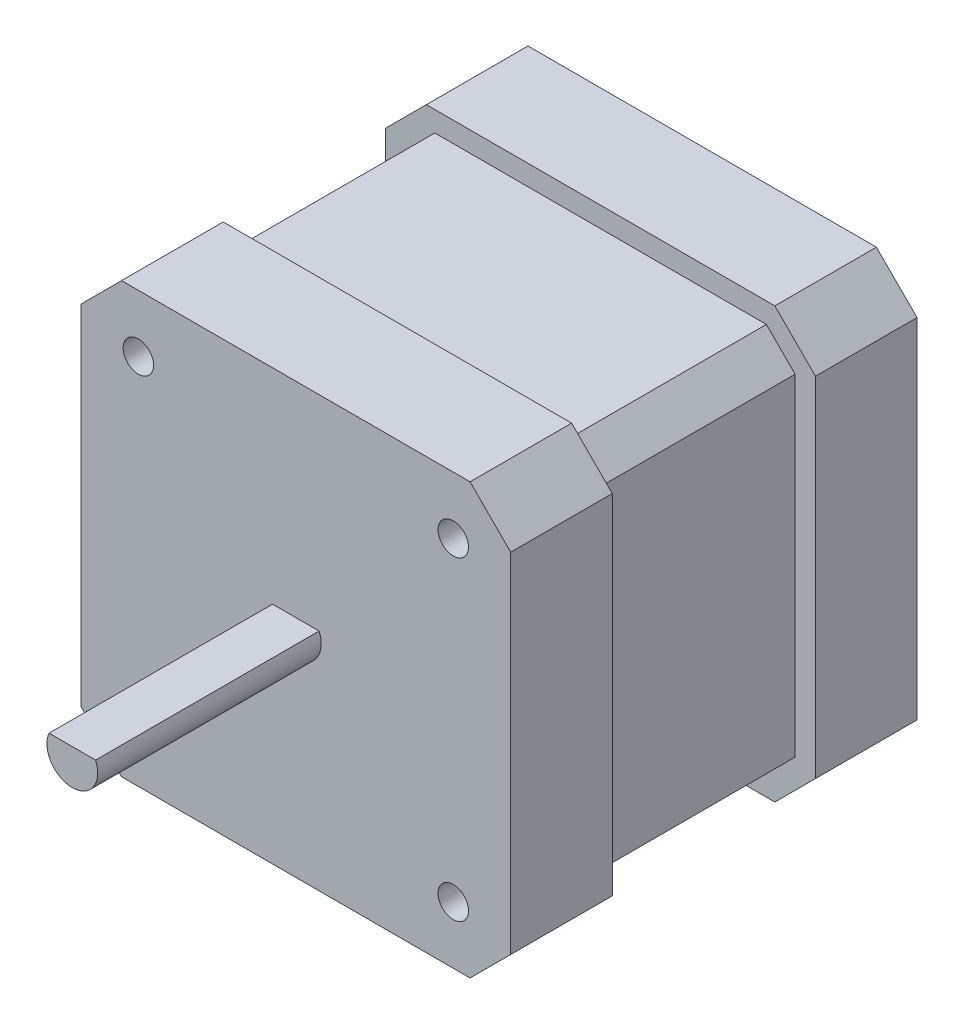
ISO-10303-21;
HEADER;
FILE_DESCRIPTION(('STEP AP214'),'2;1');
FILE_NAME('part.step','',(''),(''),'','','');
FILE_SCHEMA(('AUTOMOTIVE_DESIGN { 1 0 10303 214 1 1 1 1 }'));
ENDSEC;
DATA;
#1=APPLICATION_CONTEXT('core data for automotive mechanical design processes');
#2=APPLICATION_PROTOCOL_DEFINITION('international standard','automotive_design',2000,#1);
#3=PRODUCT_CONTEXT('',#1,'mechanical');
#4=PRODUCT('Part','Part','',(#3));
#5=PRODUCT_RELATED_PRODUCT_CATEGORY('part','',(#4));
#6=PRODUCT_DEFINITION_FORMATION('','',#4);
#7=PRODUCT_DEFINITION_CONTEXT('part definition',#1,'design');
#8=PRODUCT_DEFINITION('design','',#6,#7);
#9=PRODUCT_DEFINITION_SHAPE('','',#8);
#10=(LENGTH_UNIT() NAMED_UNIT(*) SI_UNIT(.MILLI.,.METRE.));
#11=(NAMED_UNIT(*) PLANE_ANGLE_UNIT() SI_UNIT($,.RADIAN.));
#12=(NAMED_UNIT(*) SI_UNIT($,.STERADIAN.) SOLID_ANGLE_UNIT());
#13=UNCERTAINTY_MEASURE_WITH_UNIT(LENGTH_MEASURE(1.E-05),#10,'distance_accuracy_value','');
#14=(GEOMETRIC_REPRESENTATION_CONTEXT(3) GLOBAL_UNCERTAINTY_ASSIGNED_CONTEXT((#13)) GLOBAL_UNIT_ASSIGNED_CONTEXT((#10,
#11,#12)) REPRESENTATION_CONTEXT('',''));
#15=CARTESIAN_POINT('',(0.,0.,0.));
#16=DIRECTION('',(0.,0.,1.));
#17=DIRECTION('',(1.,0.,0.));
#18=AXIS2_PLACEMENT_3D('',#15,#16,#17);
#19=CARTESIAN_POINT('',(0.,0.,10.));
#20=DIRECTION('',(0.,0.,-1.));
#21=DIRECTION('',(-1.,0.,0.));
#22=AXIS2_PLACEMENT_3D('',#19,#20,#21);
#23=PLANE('',#22);
#24=CARTESIAN_POINT('',(-15.5,-15.5,10.));
#25=DIRECTION('',(0.,0.,1.));
#26=DIRECTION('',(1.,0.,0.));
#27=AXIS2_PLACEMENT_3D('',#24,#25,#26);
#28=CIRCLE('',#27,1.5);
#29=CARTESIAN_POINT('',(-14.,-15.5,10.));
#30=VERTEX_POINT('',#29);
#31=EDGE_CURVE('E812',#30,#30,#28,.T.);
#32=ORIENTED_EDGE('',*,*,#31,.F.);
#33=EDGE_LOOP('',(#32));
#34=FACE_BOUND('',#33,.T.);
#35=CARTESIAN_POINT('',(15.5,-15.5,10.));
#36=DIRECTION('',(0.,0.,1.));
#37=DIRECTION('',(1.,0.,0.));
#38=AXIS2_PLACEMENT_3D('',#35,#36,#37);
#39=CIRCLE('',#38,1.5);
#40=CARTESIAN_POINT('',(17.,-15.5,10.));
#41=VERTEX_POINT('',#40);
#42=EDGE_CURVE('E830',#41,#41,#39,.T.);
#43=ORIENTED_EDGE('',*,*,#42,.F.);
#44=EDGE_LOOP('',(#43));
#45=FACE_BOUND('',#44,.T.);
#46=CARTESIAN_POINT('',(15.5,15.5,10.));
#47=DIRECTION('',(0.,0.,1.));
#48=DIRECTION('',(1.,0.,0.));
#49=AXIS2_PLACEMENT_3D('',#46,#47,#48);
#50=CIRCLE('',#49,1.5);
#51=CARTESIAN_POINT('',(17.,15.5,10.));
#52=VERTEX_POINT('',#51);
#53=EDGE_CURVE('E821',#52,#52,#50,.T.);
#54=ORIENTED_EDGE('',*,*,#53,.F.);
#55=EDGE_LOOP('',(#54));
#56=FACE_BOUND('',#55,.T.);
#57=CARTESIAN_POINT('',(-15.5,15.5,10.));
#58=DIRECTION('',(0.,0.,1.));
#59=DIRECTION('',(1.,0.,0.));
#60=AXIS2_PLACEMENT_3D('',#57,#58,#59);
#61=CIRCLE('',#60,1.5);
#62=CARTESIAN_POINT('',(-14.,15.5,10.));
#63=VERTEX_POINT('',#62);
#64=EDGE_CURVE('E239',#63,#63,#61,.T.);
#65=ORIENTED_EDGE('',*,*,#64,.F.);
#66=EDGE_LOOP('',(#65));
#67=FACE_BOUND('',#66,.T.);
#68=DIRECTION('',(0.707106781186547,0.707106781186548,0.));
#69=VECTOR('',#68,1.);
#70=CARTESIAN_POINT('',(-21.15,17.15,10.));
#71=LINE('',#70,#69);
#72=CARTESIAN_POINT('',(-21.15,17.15,10.));
#73=VERTEX_POINT('',#72);
#74=CARTESIAN_POINT('',(-17.15,21.15,10.));
#75=VERTEX_POINT('',#74);
#76=EDGE_CURVE('E372',#73,#75,#71,.T.);
#77=ORIENTED_EDGE('',*,*,#76,.F.);
#78=DIRECTION('',(0.,1.,0.));
#79=VECTOR('',#78,1.);
#80=CARTESIAN_POINT('',(-21.15,-17.15,10.));
#81=LINE('',#80,#79);
#82=CARTESIAN_POINT('',(-21.15,-17.15,10.));
#83=VERTEX_POINT('',#82);
#84=EDGE_CURVE('E390',#83,#73,#81,.T.);
#85=ORIENTED_EDGE('',*,*,#84,.F.);
#86=DIRECTION('',(0.707106781186548,-0.707106781186547,0.));
#87=VECTOR('',#86,1.);
#88=CARTESIAN_POINT('',(-21.15,-17.15,10.));
#89=LINE('',#88,#87);
#90=CARTESIAN_POINT('',(-17.15,-21.15,10.));
#91=VERTEX_POINT('',#90);
#92=EDGE_CURVE('E388',#83,#91,#89,.T.);
#93=ORIENTED_EDGE('',*,*,#92,.T.);
#94=DIRECTION('',(1.,0.,0.));
#95=VECTOR('',#94,1.);
#96=CARTESIAN_POINT('',(-17.15,-21.15,10.));
#97=LINE('',#96,#95);
#98=CARTESIAN_POINT('',(17.15,-21.15,10.));
#99=VERTEX_POINT('',#98);
#100=EDGE_CURVE('E386',#91,#99,#97,.T.);
#101=ORIENTED_EDGE('',*,*,#100,.T.);
#102=DIRECTION('',(0.707106781186548,0.707106781186547,0.));
#103=VECTOR('',#102,1.);
#104=CARTESIAN_POINT('',(17.15,-21.15,10.));
#105=LINE('',#104,#103);
#106=CARTESIAN_POINT('',(21.15,-17.15,10.));
#107=VERTEX_POINT('',#106);
#108=EDGE_CURVE('E384',#99,#107,#105,.T.);
#109=ORIENTED_EDGE('',*,*,#108,.T.);
#110=DIRECTION('',(0.,1.,0.));
#111=VECTOR('',#110,1.);
#112=CARTESIAN_POINT('',(21.15,-17.15,10.));
#113=LINE('',#112,#111);
#114=CARTESIAN_POINT('',(21.15,17.15,10.));
#115=VERTEX_POINT('',#114);
#116=EDGE_CURVE('E382',#107,#115,#113,.T.);
#117=ORIENTED_EDGE('',*,*,#116,.T.);
#118=DIRECTION('',(0.707106781186547,-0.707106781186548,0.));
#119=VECTOR('',#118,1.);
#120=CARTESIAN_POINT('',(17.15,21.15,10.));
#121=LINE('',#120,#119);
#122=CARTESIAN_POINT('',(17.15,21.15,10.));
#123=VERTEX_POINT('',#122);
#124=EDGE_CURVE('E379',#123,#115,#121,.T.);
#125=ORIENTED_EDGE('',*,*,#124,.F.);
#126=DIRECTION('',(1.,0.,0.));
#127=VECTOR('',#126,1.);
#128=CARTESIAN_POINT('',(-17.15,21.15,10.));
#129=LINE('',#128,#127);
#130=EDGE_CURVE('E375',#75,#123,#129,.T.);
#131=ORIENTED_EDGE('',*,*,#130,.F.);
#132=EDGE_LOOP('',(#77,#85,#93,#101,#109,#117,#125,#131));
#133=FACE_BOUND('',#132,.T.);
#134=CARTESIAN_POINT('',(0.,0.,10.));
#135=DIRECTION('',(0.,0.,1.));
#136=DIRECTION('',(1.,0.,0.));
#137=AXIS2_PLACEMENT_3D('',#134,#135,#136);
#138=CIRCLE('',#137,2.5);
#139=CARTESIAN_POINT('',(-2.29128784747792,1.,10.));
#140=VERTEX_POINT('',#139);
#141=CARTESIAN_POINT('',(2.29128784747792,1.,10.));
#142=VERTEX_POINT('',#141);
#143=EDGE_CURVE('E61',#140,#142,#138,.T.);
#144=ORIENTED_EDGE('',*,*,#143,.F.);
#145=DIRECTION('',(1.,0.,0.));
#146=VECTOR('',#145,1.);
#147=CARTESIAN_POINT('',(0.,1.,10.));
#148=LINE('',#147,#146);
#149=EDGE_CURVE('E225',#140,#142,#148,.T.);
#150=ORIENTED_EDGE('',*,*,#149,.T.);
#151=EDGE_LOOP('',(#144,#150));
#152=FACE_BOUND('',#151,.T.);
#153=ADVANCED_FACE('F45',(#34,#45,#56,#67,#133,#152),#23,.F.);
#154=CARTESIAN_POINT('',(-21.15,17.15,10.));
#155=DIRECTION('',(-0.707106781186548,0.707106781186547,0.));
#156=DIRECTION('',(-0.707106781186547,-0.707106781186548,0.));
#157=AXIS2_PLACEMENT_3D('',#154,#155,#156);
#158=PLANE('',#157);
#159=DIRECTION('',(0.707106781186547,0.707106781186548,0.));
#160=VECTOR('',#159,1.);
#161=CARTESIAN_POINT('',(-21.15,17.15,0.));
#162=LINE('',#161,#160);
#163=CARTESIAN_POINT('',(-21.15,17.15,0.));
#164=VERTEX_POINT('',#163);
#165=CARTESIAN_POINT('',(-17.15,21.15,0.));
#166=VERTEX_POINT('',#165);
#167=EDGE_CURVE('E371',#164,#166,#162,.T.);
#168=ORIENTED_EDGE('',*,*,#167,.F.);
#169=DIRECTION('',(0.,0.,-1.));
#170=VECTOR('',#169,1.);
#171=CARTESIAN_POINT('',(-21.15,17.15,10.));
#172=LINE('',#171,#170);
#173=EDGE_CURVE('E11',#73,#164,#172,.T.);
#174=ORIENTED_EDGE('',*,*,#173,.F.);
#175=ORIENTED_EDGE('',*,*,#76,.T.);
#176=DIRECTION('',(0.,0.,-1.));
#177=VECTOR('',#176,1.);
#178=CARTESIAN_POINT('',(-17.15,21.15,10.));
#179=LINE('',#178,#177);
#180=EDGE_CURVE('E49',#75,#166,#179,.T.);
#181=ORIENTED_EDGE('',*,*,#180,.T.);
#182=EDGE_LOOP('',(#168,#174,#175,#181));
#183=FACE_BOUND('',#182,.T.);
#184=ADVANCED_FACE('F47',(#183),#158,.T.);
#185=CARTESIAN_POINT('',(-21.15,-17.15,10.));
#186=DIRECTION('',(-1.,0.,0.));
#187=DIRECTION('',(0.,0.,1.));
#188=AXIS2_PLACEMENT_3D('',#185,#186,#187);
#189=PLANE('',#188);
#190=DIRECTION('',(0.,1.,0.));
#191=VECTOR('',#190,1.);
#192=CARTESIAN_POINT('',(-21.15,-17.15,0.));
#193=LINE('',#192,#191);
#194=CARTESIAN_POINT('',(-21.15,-17.15,0.));
#195=VERTEX_POINT('',#194);
#196=EDGE_CURVE('E376',#195,#164,#193,.T.);
#197=ORIENTED_EDGE('',*,*,#196,.F.);
#198=DIRECTION('',(0.,0.,-1.));
#199=VECTOR('',#198,1.);
#200=CARTESIAN_POINT('',(-21.15,-17.15,10.));
#201=LINE('',#200,#199);
#202=EDGE_CURVE('E54',#83,#195,#201,.T.);
#203=ORIENTED_EDGE('',*,*,#202,.F.);
#204=ORIENTED_EDGE('',*,*,#84,.T.);
#205=ORIENTED_EDGE('',*,*,#173,.T.);
#206=EDGE_LOOP('',(#197,#203,#204,#205));
#207=FACE_BOUND('',#206,.T.);
#208=ADVANCED_FACE('F438',(#207),#189,.T.);
#209=CARTESIAN_POINT('',(-21.15,-17.15,10.));
#210=DIRECTION('',(0.707106781186547,0.707106781186548,0.));
#211=DIRECTION('',(-0.707106781186548,0.707106781186547,0.));
#212=AXIS2_PLACEMENT_3D('',#209,#210,#211);
#213=PLANE('',#212);
#214=DIRECTION('',(0.707106781186548,-0.707106781186547,0.));
#215=VECTOR('',#214,1.);
#216=CARTESIAN_POINT('',(-21.15,-17.15,0.));
#217=LINE('',#216,#215);
#218=CARTESIAN_POINT('',(-17.15,-21.15,0.));
#219=VERTEX_POINT('',#218);
#220=EDGE_CURVE('E408',#195,#219,#217,.T.);
#221=ORIENTED_EDGE('',*,*,#220,.T.);
#222=DIRECTION('',(0.,0.,-1.));
#223=VECTOR('',#222,1.);
#224=CARTESIAN_POINT('',(-17.15,-21.15,10.));
#225=LINE('',#224,#223);
#226=EDGE_CURVE('E413',#91,#219,#225,.T.);
#227=ORIENTED_EDGE('',*,*,#226,.F.);
#228=ORIENTED_EDGE('',*,*,#92,.F.);
#229=ORIENTED_EDGE('',*,*,#202,.T.);
#230=EDGE_LOOP('',(#221,#227,#228,#229));
#231=FACE_BOUND('',#230,.T.);
#232=ADVANCED_FACE('F461',(#231),#213,.F.);
#233=CARTESIAN_POINT('',(-17.15,-21.15,10.));
#234=DIRECTION('',(0.,1.,0.));
#235=DIRECTION('',(0.,0.,1.));
#236=AXIS2_PLACEMENT_3D('',#233,#234,#235);
#237=PLANE('',#236);
#238=DIRECTION('',(1.,0.,0.));
#239=VECTOR('',#238,1.);
#240=CARTESIAN_POINT('',(-17.15,-21.15,0.));
#241=LINE('',#240,#239);
#242=CARTESIAN_POINT('',(17.15,-21.15,0.));
#243=VERTEX_POINT('',#242);
#244=EDGE_CURVE('E406',#219,#243,#241,.T.);
#245=ORIENTED_EDGE('',*,*,#244,.T.);
#246=DIRECTION('',(0.,0.,-1.));
#247=VECTOR('',#246,1.);
#248=CARTESIAN_POINT('',(17.15,-21.15,10.));
#249=LINE('',#248,#247);
#250=EDGE_CURVE('E416',#99,#243,#249,.T.);
#251=ORIENTED_EDGE('',*,*,#250,.F.);
#252=ORIENTED_EDGE('',*,*,#100,.F.);
#253=ORIENTED_EDGE('',*,*,#226,.T.);
#254=EDGE_LOOP('',(#245,#251,#252,#253));
#255=FACE_BOUND('',#254,.T.);
#256=ADVANCED_FACE('F458',(#255),#237,.F.);
#257=CARTESIAN_POINT('',(17.15,-21.15,10.));
#258=DIRECTION('',(-0.707106781186547,0.707106781186548,0.));
#259=DIRECTION('',(-0.707106781186548,-0.707106781186547,0.));
#260=AXIS2_PLACEMENT_3D('',#257,#258,#259);
#261=PLANE('',#260);
#262=DIRECTION('',(0.707106781186548,0.707106781186547,0.));
#263=VECTOR('',#262,1.);
#264=CARTESIAN_POINT('',(17.15,-21.15,0.));
#265=LINE('',#264,#263);
#266=CARTESIAN_POINT('',(21.15,-17.15,0.));
#267=VERTEX_POINT('',#266);
#268=EDGE_CURVE('E404',#243,#267,#265,.T.);
#269=ORIENTED_EDGE('',*,*,#268,.T.);
#270=DIRECTION('',(0.,0.,-1.));
#271=VECTOR('',#270,1.);
#272=CARTESIAN_POINT('',(21.15,-17.15,10.));
#273=LINE('',#272,#271);
#274=EDGE_CURVE('E419',#107,#267,#273,.T.);
#275=ORIENTED_EDGE('',*,*,#274,.F.);
#276=ORIENTED_EDGE('',*,*,#108,.F.);
#277=ORIENTED_EDGE('',*,*,#250,.T.);
#278=EDGE_LOOP('',(#269,#275,#276,#277));
#279=FACE_BOUND('',#278,.T.);
#280=ADVANCED_FACE('F454',(#279),#261,.F.);
#281=CARTESIAN_POINT('',(21.15,-17.15,10.));
#282=DIRECTION('',(-1.,0.,0.));
#283=DIRECTION('',(0.,-1.,0.));
#284=AXIS2_PLACEMENT_3D('',#281,#282,#283);
#285=PLANE('',#284);
#286=DIRECTION('',(0.,1.,0.));
#287=VECTOR('',#286,1.);
#288=CARTESIAN_POINT('',(21.15,-17.15,0.));
#289=LINE('',#288,#287);
#290=CARTESIAN_POINT('',(21.15,17.15,0.));
#291=VERTEX_POINT('',#290);
#292=EDGE_CURVE('E401',#267,#291,#289,.T.);
#293=ORIENTED_EDGE('',*,*,#292,.T.);
#294=DIRECTION('',(0.,0.,-1.));
#295=VECTOR('',#294,1.);
#296=CARTESIAN_POINT('',(21.15,17.15,10.));
#297=LINE('',#296,#295);
#298=EDGE_CURVE('E422',#115,#291,#297,.T.);
#299=ORIENTED_EDGE('',*,*,#298,.F.);
#300=ORIENTED_EDGE('',*,*,#116,.F.);
#301=ORIENTED_EDGE('',*,*,#274,.T.);
#302=EDGE_LOOP('',(#293,#299,#300,#301));
#303=FACE_BOUND('',#302,.T.);
#304=ADVANCED_FACE('F450',(#303),#285,.F.);
#305=CARTESIAN_POINT('',(17.15,21.15,10.));
#306=DIRECTION('',(0.707106781186548,0.707106781186547,0.));
#307=DIRECTION('',(-0.707106781186547,0.707106781186548,0.));
#308=AXIS2_PLACEMENT_3D('',#305,#306,#307);
#309=PLANE('',#308);
#310=DIRECTION('',(0.707106781186547,-0.707106781186548,0.));
#311=VECTOR('',#310,1.);
#312=CARTESIAN_POINT('',(17.15,21.15,0.));
#313=LINE('',#312,#311);
#314=CARTESIAN_POINT('',(17.15,21.15,0.));
#315=VERTEX_POINT('',#314);
#316=EDGE_CURVE('E398',#315,#291,#313,.T.);
#317=ORIENTED_EDGE('',*,*,#316,.F.);
#318=DIRECTION('',(0.,0.,-1.));
#319=VECTOR('',#318,1.);
#320=CARTESIAN_POINT('',(17.15,21.15,10.));
#321=LINE('',#320,#319);
#322=EDGE_CURVE('E423',#123,#315,#321,.T.);
#323=ORIENTED_EDGE('',*,*,#322,.F.);
#324=ORIENTED_EDGE('',*,*,#124,.T.);
#325=ORIENTED_EDGE('',*,*,#298,.T.);
#326=EDGE_LOOP('',(#317,#323,#324,#325));
#327=FACE_BOUND('',#326,.T.);
#328=ADVANCED_FACE('F446',(#327),#309,.T.);
#329=CARTESIAN_POINT('',(-17.15,21.15,10.));
#330=DIRECTION('',(0.,1.,0.));
#331=DIRECTION('',(0.,0.,1.));
#332=AXIS2_PLACEMENT_3D('',#329,#330,#331);
#333=PLANE('',#332);
#334=DIRECTION('',(1.,0.,0.));
#335=VECTOR('',#334,1.);
#336=CARTESIAN_POINT('',(-17.15,21.15,0.));
#337=LINE('',#336,#335);
#338=EDGE_CURVE('E395',#166,#315,#337,.T.);
#339=ORIENTED_EDGE('',*,*,#338,.F.);
#340=ORIENTED_EDGE('',*,*,#180,.F.);
#341=ORIENTED_EDGE('',*,*,#130,.T.);
#342=ORIENTED_EDGE('',*,*,#322,.T.);
#343=EDGE_LOOP('',(#339,#340,#341,#342));
#344=FACE_BOUND('',#343,.T.);
#345=ADVANCED_FACE('F431',(#344),#333,.T.);
#346=CARTESIAN_POINT('',(0.,0.,0.));
#347=DIRECTION('',(0.,0.,-1.));
#348=DIRECTION('',(-1.,0.,0.));
#349=AXIS2_PLACEMENT_3D('',#346,#347,#348);
#350=PLANE('',#349);
#351=DIRECTION('',(0.,1.,0.));
#352=VECTOR('',#351,1.);
#353=CARTESIAN_POINT('',(-19.15,-16.3215728752538,0.));
#354=LINE('',#353,#352);
#355=CARTESIAN_POINT('',(-19.15,-16.3215728752538,0.));
#356=VERTEX_POINT('',#355);
#357=CARTESIAN_POINT('',(-19.15,16.3215728752538,0.));
#358=VERTEX_POINT('',#357);
#359=EDGE_CURVE('E69',#356,#358,#354,.T.);
#360=ORIENTED_EDGE('',*,*,#359,.F.);
#361=DIRECTION('',(-0.707106781186548,0.707106781186547,0.));
#362=VECTOR('',#361,1.);
#363=CARTESIAN_POINT('',(-16.3215728752538,-19.15,0.));
#364=LINE('',#363,#362);
#365=CARTESIAN_POINT('',(-16.3215728752538,-19.15,0.));
#366=VERTEX_POINT('',#365);
#367=EDGE_CURVE('E306',#366,#356,#364,.T.);
#368=ORIENTED_EDGE('',*,*,#367,.F.);
#369=DIRECTION('',(-1.,0.,0.));
#370=VECTOR('',#369,1.);
#371=CARTESIAN_POINT('',(16.3215728752538,-19.15,0.));
#372=LINE('',#371,#370);
#373=CARTESIAN_POINT('',(16.3215728752538,-19.15,0.));
#374=VERTEX_POINT('',#373);
#375=EDGE_CURVE('E344',#374,#366,#372,.T.);
#376=ORIENTED_EDGE('',*,*,#375,.F.);
#377=DIRECTION('',(-0.707106781186548,-0.707106781186547,0.));
#378=VECTOR('',#377,1.);
#379=CARTESIAN_POINT('',(19.15,-16.3215728752538,0.));
#380=LINE('',#379,#378);
#381=CARTESIAN_POINT('',(19.15,-16.3215728752538,0.));
#382=VERTEX_POINT('',#381);
#383=EDGE_CURVE('E341',#382,#374,#380,.T.);
#384=ORIENTED_EDGE('',*,*,#383,.F.);
#385=DIRECTION('',(0.,-1.,0.));
#386=VECTOR('',#385,1.);
#387=CARTESIAN_POINT('',(19.15,16.3215728752538,0.));
#388=LINE('',#387,#386);
#389=CARTESIAN_POINT('',(19.15,16.3215728752538,0.));
#390=VERTEX_POINT('',#389);
#391=EDGE_CURVE('E338',#390,#382,#388,.T.);
#392=ORIENTED_EDGE('',*,*,#391,.F.);
#393=DIRECTION('',(0.707106781186547,-0.707106781186548,0.));
#394=VECTOR('',#393,1.);
#395=CARTESIAN_POINT('',(16.3215728752538,19.15,0.));
#396=LINE('',#395,#394);
#397=CARTESIAN_POINT('',(16.3215728752538,19.15,0.));
#398=VERTEX_POINT('',#397);
#399=EDGE_CURVE('E335',#398,#390,#396,.T.);
#400=ORIENTED_EDGE('',*,*,#399,.F.);
#401=DIRECTION('',(1.,0.,0.));
#402=VECTOR('',#401,1.);
#403=CARTESIAN_POINT('',(-16.3215728752538,19.15,0.));
#404=LINE('',#403,#402);
#405=CARTESIAN_POINT('',(-16.3215728752538,19.15,0.));
#406=VERTEX_POINT('',#405);
#407=EDGE_CURVE('E332',#406,#398,#404,.T.);
#408=ORIENTED_EDGE('',*,*,#407,.F.);
#409=DIRECTION('',(0.707106781186547,0.707106781186548,0.));
#410=VECTOR('',#409,1.);
#411=CARTESIAN_POINT('',(-19.15,16.3215728752538,0.));
#412=LINE('',#411,#410);
#413=EDGE_CURVE('E329',#358,#406,#412,.T.);
#414=ORIENTED_EDGE('',*,*,#413,.F.);
#415=EDGE_LOOP('',(#360,#368,#376,#384,#392,#400,#408,#414));
#416=FACE_BOUND('',#415,.T.);
#417=ORIENTED_EDGE('',*,*,#167,.T.);
#418=ORIENTED_EDGE('',*,*,#338,.T.);
#419=ORIENTED_EDGE('',*,*,#316,.T.);
#420=ORIENTED_EDGE('',*,*,#292,.F.);
#421=ORIENTED_EDGE('',*,*,#268,.F.);
#422=ORIENTED_EDGE('',*,*,#244,.F.);
#423=ORIENTED_EDGE('',*,*,#220,.F.);
#424=ORIENTED_EDGE('',*,*,#196,.T.);
#425=EDGE_LOOP('',(#417,#418,#419,#420,#421,#422,#423,#424));
#426=FACE_BOUND('',#425,.T.);
#427=ADVANCED_FACE('F433',(#416,#426),#350,.T.);
#428=CARTESIAN_POINT('',(-19.15,-16.3215728752538,-20.));
#429=DIRECTION('',(1.,0.,0.));
#430=DIRECTION('',(0.,0.,-1.));
#431=AXIS2_PLACEMENT_3D('',#428,#429,#430);
#432=PLANE('',#431);
#433=ORIENTED_EDGE('',*,*,#359,.T.);
#434=DIRECTION('',(0.,0.,1.));
#435=VECTOR('',#434,1.);
#436=CARTESIAN_POINT('',(-19.15,16.3215728752538,-20.));
#437=LINE('',#436,#435);
#438=CARTESIAN_POINT('',(-19.15,16.3215728752538,-20.));
#439=VERTEX_POINT('',#438);
#440=EDGE_CURVE('E368',#439,#358,#437,.T.);
#441=ORIENTED_EDGE('',*,*,#440,.F.);
#442=DIRECTION('',(0.,1.,0.));
#443=VECTOR('',#442,1.);
#444=CARTESIAN_POINT('',(-19.15,-16.3215728752538,-20.));
#445=LINE('',#444,#443);
#446=CARTESIAN_POINT('',(-19.15,-16.3215728752538,-20.));
#447=VERTEX_POINT('',#446);
#448=EDGE_CURVE('E302',#447,#439,#445,.T.);
#449=ORIENTED_EDGE('',*,*,#448,.F.);
#450=DIRECTION('',(0.,0.,1.));
#451=VECTOR('',#450,1.);
#452=CARTESIAN_POINT('',(-19.15,-16.3215728752538,-20.));
#453=LINE('',#452,#451);
#454=EDGE_CURVE('E327',#447,#356,#453,.T.);
#455=ORIENTED_EDGE('',*,*,#454,.T.);
#456=EDGE_LOOP('',(#433,#441,#449,#455));
#457=FACE_BOUND('',#456,.T.);
#458=ADVANCED_FACE('F480',(#457),#432,.F.);
#459=CARTESIAN_POINT('',(-19.15,16.3215728752538,-20.));
#460=DIRECTION('',(0.707106781186548,-0.707106781186547,0.));
#461=DIRECTION('',(0.707106781186547,0.707106781186548,0.));
#462=AXIS2_PLACEMENT_3D('',#459,#460,#461);
#463=PLANE('',#462);
#464=ORIENTED_EDGE('',*,*,#413,.T.);
#465=DIRECTION('',(0.,0.,1.));
#466=VECTOR('',#465,1.);
#467=CARTESIAN_POINT('',(-16.3215728752538,19.15,-20.));
#468=LINE('',#467,#466);
#469=CARTESIAN_POINT('',(-16.3215728752538,19.15,-20.));
#470=VERTEX_POINT('',#469);
#471=EDGE_CURVE('E365',#470,#406,#468,.T.);
#472=ORIENTED_EDGE('',*,*,#471,.F.);
#473=DIRECTION('',(0.707106781186547,0.707106781186548,0.));
#474=VECTOR('',#473,1.);
#475=CARTESIAN_POINT('',(-19.15,16.3215728752538,-20.));
#476=LINE('',#475,#474);
#477=EDGE_CURVE('E305',#439,#470,#476,.T.);
#478=ORIENTED_EDGE('',*,*,#477,.F.);
#479=ORIENTED_EDGE('',*,*,#440,.T.);
#480=EDGE_LOOP('',(#464,#472,#478,#479));
#481=FACE_BOUND('',#480,.T.);
#482=ADVANCED_FACE('F487',(#481),#463,.F.);
#483=CARTESIAN_POINT('',(-16.3215728752538,19.15,-20.));
#484=DIRECTION('',(0.,-1.,0.));
#485=DIRECTION('',(0.,0.,-1.));
#486=AXIS2_PLACEMENT_3D('',#483,#484,#485);
#487=PLANE('',#486);
#488=ORIENTED_EDGE('',*,*,#407,.T.);
#489=DIRECTION('',(0.,0.,1.));
#490=VECTOR('',#489,1.);
#491=CARTESIAN_POINT('',(16.3215728752538,19.15,-20.));
#492=LINE('',#491,#490);
#493=CARTESIAN_POINT('',(16.3215728752538,19.15,-20.));
#494=VERTEX_POINT('',#493);
#495=EDGE_CURVE('E362',#494,#398,#492,.T.);
#496=ORIENTED_EDGE('',*,*,#495,.F.);
#497=DIRECTION('',(1.,0.,0.));
#498=VECTOR('',#497,1.);
#499=CARTESIAN_POINT('',(-16.3215728752538,19.15,-20.));
#500=LINE('',#499,#498);
#501=EDGE_CURVE('E309',#470,#494,#500,.T.);
#502=ORIENTED_EDGE('',*,*,#501,.F.);
#503=ORIENTED_EDGE('',*,*,#471,.T.);
#504=EDGE_LOOP('',(#488,#496,#502,#503));
#505=FACE_BOUND('',#504,.T.);
#506=ADVANCED_FACE('F532',(#505),#487,.F.);
#507=CARTESIAN_POINT('',(16.3215728752538,19.15,-20.));
#508=DIRECTION('',(-0.707106781186548,-0.707106781186547,0.));
#509=DIRECTION('',(0.707106781186547,-0.707106781186548,0.));
#510=AXIS2_PLACEMENT_3D('',#507,#508,#509);
#511=PLANE('',#510);
#512=ORIENTED_EDGE('',*,*,#399,.T.);
#513=DIRECTION('',(0.,0.,1.));
#514=VECTOR('',#513,1.);
#515=CARTESIAN_POINT('',(19.15,16.3215728752538,-20.));
#516=LINE('',#515,#514);
#517=CARTESIAN_POINT('',(19.15,16.3215728752538,-20.));
#518=VERTEX_POINT('',#517);
#519=EDGE_CURVE('E359',#518,#390,#516,.T.);
#520=ORIENTED_EDGE('',*,*,#519,.F.);
#521=DIRECTION('',(0.707106781186547,-0.707106781186548,0.));
#522=VECTOR('',#521,1.);
#523=CARTESIAN_POINT('',(16.3215728752538,19.15,-20.));
#524=LINE('',#523,#522);
#525=EDGE_CURVE('E312',#494,#518,#524,.T.);
#526=ORIENTED_EDGE('',*,*,#525,.F.);
#527=ORIENTED_EDGE('',*,*,#495,.T.);
#528=EDGE_LOOP('',(#512,#520,#526,#527));
#529=FACE_BOUND('',#528,.T.);
#530=ADVANCED_FACE('F541',(#529),#511,.F.);
#531=CARTESIAN_POINT('',(19.15,16.3215728752538,-20.));
#532=DIRECTION('',(-1.,0.,0.));
#533=DIRECTION('',(0.,-1.,0.));
#534=AXIS2_PLACEMENT_3D('',#531,#532,#533);
#535=PLANE('',#534);
#536=ORIENTED_EDGE('',*,*,#391,.T.);
#537=DIRECTION('',(0.,0.,1.));
#538=VECTOR('',#537,1.);
#539=CARTESIAN_POINT('',(19.15,-16.3215728752538,-20.));
#540=LINE('',#539,#538);
#541=CARTESIAN_POINT('',(19.15,-16.3215728752538,-20.));
#542=VERTEX_POINT('',#541);
#543=EDGE_CURVE('E356',#542,#382,#540,.T.);
#544=ORIENTED_EDGE('',*,*,#543,.F.);
#545=DIRECTION('',(0.,-1.,0.));
#546=VECTOR('',#545,1.);
#547=CARTESIAN_POINT('',(19.15,16.3215728752538,-20.));
#548=LINE('',#547,#546);
#549=EDGE_CURVE('E315',#518,#542,#548,.T.);
#550=ORIENTED_EDGE('',*,*,#549,.F.);
#551=ORIENTED_EDGE('',*,*,#519,.T.);
#552=EDGE_LOOP('',(#536,#544,#550,#551));
#553=FACE_BOUND('',#552,.T.);
#554=ADVANCED_FACE('F551',(#553),#535,.F.);
#555=CARTESIAN_POINT('',(19.15,-16.3215728752538,-20.));
#556=DIRECTION('',(-0.707106781186547,0.707106781186548,0.));
#557=DIRECTION('',(-0.707106781186548,-0.707106781186547,0.));
#558=AXIS2_PLACEMENT_3D('',#555,#556,#557);
#559=PLANE('',#558);
#560=ORIENTED_EDGE('',*,*,#383,.T.);
#561=DIRECTION('',(0.,0.,1.));
#562=VECTOR('',#561,1.);
#563=CARTESIAN_POINT('',(16.3215728752538,-19.15,-20.));
#564=LINE('',#563,#562);
#565=CARTESIAN_POINT('',(16.3215728752538,-19.15,-20.));
#566=VERTEX_POINT('',#565);
#567=EDGE_CURVE('E353',#566,#374,#564,.T.);
#568=ORIENTED_EDGE('',*,*,#567,.F.);
#569=DIRECTION('',(-0.707106781186548,-0.707106781186547,0.));
#570=VECTOR('',#569,1.);
#571=CARTESIAN_POINT('',(19.15,-16.3215728752538,-20.));
#572=LINE('',#571,#570);
#573=EDGE_CURVE('E318',#542,#566,#572,.T.);
#574=ORIENTED_EDGE('',*,*,#573,.F.);
#575=ORIENTED_EDGE('',*,*,#543,.T.);
#576=EDGE_LOOP('',(#560,#568,#574,#575));
#577=FACE_BOUND('',#576,.T.);
#578=ADVANCED_FACE('F561',(#577),#559,.F.);
#579=CARTESIAN_POINT('',(16.3215728752538,-19.15,-20.));
#580=DIRECTION('',(0.,1.,0.));
#581=DIRECTION('',(0.,0.,1.));
#582=AXIS2_PLACEMENT_3D('',#579,#580,#581);
#583=PLANE('',#582);
#584=ORIENTED_EDGE('',*,*,#375,.T.);
#585=DIRECTION('',(0.,0.,1.));
#586=VECTOR('',#585,1.);
#587=CARTESIAN_POINT('',(-16.3215728752538,-19.15,-20.));
#588=LINE('',#587,#586);
#589=CARTESIAN_POINT('',(-16.3215728752538,-19.15,-20.));
#590=VERTEX_POINT('',#589);
#591=EDGE_CURVE('E350',#590,#366,#588,.T.);
#592=ORIENTED_EDGE('',*,*,#591,.F.);
#593=DIRECTION('',(-1.,0.,0.));
#594=VECTOR('',#593,1.);
#595=CARTESIAN_POINT('',(16.3215728752538,-19.15,-20.));
#596=LINE('',#595,#594);
#597=EDGE_CURVE('E321',#566,#590,#596,.T.);
#598=ORIENTED_EDGE('',*,*,#597,.F.);
#599=ORIENTED_EDGE('',*,*,#567,.T.);
#600=EDGE_LOOP('',(#584,#592,#598,#599));
#601=FACE_BOUND('',#600,.T.);
#602=ADVANCED_FACE('F571',(#601),#583,.F.);
#603=CARTESIAN_POINT('',(-16.3215728752538,-19.15,-20.));
#604=DIRECTION('',(0.707106781186547,0.707106781186548,0.));
#605=DIRECTION('',(-0.707106781186548,0.707106781186547,0.));
#606=AXIS2_PLACEMENT_3D('',#603,#604,#605);
#607=PLANE('',#606);
#608=ORIENTED_EDGE('',*,*,#367,.T.);
#609=ORIENTED_EDGE('',*,*,#454,.F.);
#610=DIRECTION('',(-0.707106781186548,0.707106781186547,0.));
#611=VECTOR('',#610,1.);
#612=CARTESIAN_POINT('',(-16.3215728752538,-19.15,-20.));
#613=LINE('',#612,#611);
#614=EDGE_CURVE('E324',#590,#447,#613,.T.);
#615=ORIENTED_EDGE('',*,*,#614,.F.);
#616=ORIENTED_EDGE('',*,*,#591,.T.);
#617=EDGE_LOOP('',(#608,#609,#615,#616));
#618=FACE_BOUND('',#617,.T.);
#619=ADVANCED_FACE('F581',(#618),#607,.F.);
#620=CARTESIAN_POINT('',(0.,0.,-20.));
#621=DIRECTION('',(0.,0.,-1.));
#622=DIRECTION('',(-1.,0.,0.));
#623=AXIS2_PLACEMENT_3D('',#620,#621,#622);
#624=PLANE('',#623);
#625=DIRECTION('',(0.,1.,0.));
#626=VECTOR('',#625,1.);
#627=CARTESIAN_POINT('',(-21.15,-17.15,-20.));
#628=LINE('',#627,#626);
#629=CARTESIAN_POINT('',(-21.15,-17.15,-20.));
#630=VERTEX_POINT('',#629);
#631=CARTESIAN_POINT('',(-21.15,17.15,-20.));
#632=VERTEX_POINT('',#631);
#633=EDGE_CURVE('E227',#630,#632,#628,.T.);
#634=ORIENTED_EDGE('',*,*,#633,.F.);
#635=DIRECTION('',(-0.707106781186548,0.707106781186547,0.));
#636=VECTOR('',#635,1.);
#637=CARTESIAN_POINT('',(-17.15,-21.15,-20.));
#638=LINE('',#637,#636);
#639=CARTESIAN_POINT('',(-17.15,-21.15,-20.));
#640=VERTEX_POINT('',#639);
#641=EDGE_CURVE('E249',#640,#630,#638,.T.);
#642=ORIENTED_EDGE('',*,*,#641,.F.);
#643=DIRECTION('',(-1.,0.,0.));
#644=VECTOR('',#643,1.);
#645=CARTESIAN_POINT('',(17.15,-21.15,-20.));
#646=LINE('',#645,#644);
#647=CARTESIAN_POINT('',(17.15,-21.15,-20.));
#648=VERTEX_POINT('',#647);
#649=EDGE_CURVE('E276',#648,#640,#646,.T.);
#650=ORIENTED_EDGE('',*,*,#649,.F.);
#651=DIRECTION('',(-0.707106781186548,-0.707106781186547,0.));
#652=VECTOR('',#651,1.);
#653=CARTESIAN_POINT('',(21.15,-17.15,-20.));
#654=LINE('',#653,#652);
#655=CARTESIAN_POINT('',(21.15,-17.15,-20.));
#656=VERTEX_POINT('',#655);
#657=EDGE_CURVE('E274',#656,#648,#654,.T.);
#658=ORIENTED_EDGE('',*,*,#657,.F.);
#659=DIRECTION('',(0.,-1.,0.));
#660=VECTOR('',#659,1.);
#661=CARTESIAN_POINT('',(21.15,17.15,-20.));
#662=LINE('',#661,#660);
#663=CARTESIAN_POINT('',(21.15,17.15,-20.));
#664=VERTEX_POINT('',#663);
#665=EDGE_CURVE('E272',#664,#656,#662,.T.);
#666=ORIENTED_EDGE('',*,*,#665,.F.);
#667=DIRECTION('',(0.707106781186547,-0.707106781186548,0.));
#668=VECTOR('',#667,1.);
#669=CARTESIAN_POINT('',(17.15,21.15,-20.));
#670=LINE('',#669,#668);
#671=CARTESIAN_POINT('',(17.15,21.15,-20.));
#672=VERTEX_POINT('',#671);
#673=EDGE_CURVE('E270',#672,#664,#670,.T.);
#674=ORIENTED_EDGE('',*,*,#673,.F.);
#675=DIRECTION('',(1.,0.,0.));
#676=VECTOR('',#675,1.);
#677=CARTESIAN_POINT('',(-17.15,21.15,-20.));
#678=LINE('',#677,#676);
#679=CARTESIAN_POINT('',(-17.15,21.15,-20.));
#680=VERTEX_POINT('',#679);
#681=EDGE_CURVE('E268',#680,#672,#678,.T.);
#682=ORIENTED_EDGE('',*,*,#681,.F.);
#683=DIRECTION('',(0.707106781186547,0.707106781186548,0.));
#684=VECTOR('',#683,1.);
#685=CARTESIAN_POINT('',(-21.15,17.15,-20.));
#686=LINE('',#685,#684);
#687=EDGE_CURVE('E266',#632,#680,#686,.T.);
#688=ORIENTED_EDGE('',*,*,#687,.F.);
#689=EDGE_LOOP('',(#634,#642,#650,#658,#666,#674,#682,#688));
#690=FACE_BOUND('',#689,.T.);
#691=ORIENTED_EDGE('',*,*,#614,.T.);
#692=ORIENTED_EDGE('',*,*,#448,.T.);
#693=ORIENTED_EDGE('',*,*,#477,.T.);
#694=ORIENTED_EDGE('',*,*,#501,.T.);
#695=ORIENTED_EDGE('',*,*,#525,.T.);
#696=ORIENTED_EDGE('',*,*,#549,.T.);
#697=ORIENTED_EDGE('',*,*,#573,.T.);
#698=ORIENTED_EDGE('',*,*,#597,.T.);
#699=EDGE_LOOP('',(#691,#692,#693,#694,#695,#696,#697,#698));
#700=FACE_BOUND('',#699,.T.);
#701=ADVANCED_FACE('F591',(#690,#700),#624,.F.);
#702=CARTESIAN_POINT('',(-21.15,-17.15,-30.));
#703=DIRECTION('',(1.,0.,0.));
#704=DIRECTION('',(0.,0.,-1.));
#705=AXIS2_PLACEMENT_3D('',#702,#703,#704);
#706=PLANE('',#705);
#707=ORIENTED_EDGE('',*,*,#633,.T.);
#708=DIRECTION('',(0.,0.,1.));
#709=VECTOR('',#708,1.);
#710=CARTESIAN_POINT('',(-21.15,17.15,-30.));
#711=LINE('',#710,#709);
#712=CARTESIAN_POINT('',(-21.15,17.15,-30.));
#713=VERTEX_POINT('',#712);
#714=EDGE_CURVE('E299',#713,#632,#711,.T.);
#715=ORIENTED_EDGE('',*,*,#714,.F.);
#716=DIRECTION('',(0.,1.,0.));
#717=VECTOR('',#716,1.);
#718=CARTESIAN_POINT('',(-21.15,-17.15,-30.));
#719=LINE('',#718,#717);
#720=CARTESIAN_POINT('',(-21.15,-17.15,-30.));
#721=VERTEX_POINT('',#720);
#722=EDGE_CURVE('E245',#721,#713,#719,.T.);
#723=ORIENTED_EDGE('',*,*,#722,.F.);
#724=DIRECTION('',(0.,0.,1.));
#725=VECTOR('',#724,1.);
#726=CARTESIAN_POINT('',(-21.15,-17.15,-30.));
#727=LINE('',#726,#725);
#728=EDGE_CURVE('E263',#721,#630,#727,.T.);
#729=ORIENTED_EDGE('',*,*,#728,.T.);
#730=EDGE_LOOP('',(#707,#715,#723,#729));
#731=FACE_BOUND('',#730,.T.);
#732=ADVANCED_FACE('F601',(#731),#706,.F.);
#733=CARTESIAN_POINT('',(-21.15,17.15,-30.));
#734=DIRECTION('',(0.707106781186548,-0.707106781186547,0.));
#735=DIRECTION('',(0.707106781186547,0.707106781186548,0.));
#736=AXIS2_PLACEMENT_3D('',#733,#734,#735);
#737=PLANE('',#736);
#738=ORIENTED_EDGE('',*,*,#687,.T.);
#739=DIRECTION('',(0.,0.,1.));
#740=VECTOR('',#739,1.);
#741=CARTESIAN_POINT('',(-17.15,21.15,-30.));
#742=LINE('',#741,#740);
#743=CARTESIAN_POINT('',(-17.15,21.15,-30.));
#744=VERTEX_POINT('',#743);
#745=EDGE_CURVE('E296',#744,#680,#742,.T.);
#746=ORIENTED_EDGE('',*,*,#745,.F.);
#747=DIRECTION('',(0.707106781186547,0.707106781186548,0.));
#748=VECTOR('',#747,1.);
#749=CARTESIAN_POINT('',(-21.15,17.15,-30.));
#750=LINE('',#749,#748);
#751=EDGE_CURVE('E248',#713,#744,#750,.T.);
#752=ORIENTED_EDGE('',*,*,#751,.F.);
#753=ORIENTED_EDGE('',*,*,#714,.T.);
#754=EDGE_LOOP('',(#738,#746,#752,#753));
#755=FACE_BOUND('',#754,.T.);
#756=ADVANCED_FACE('F611',(#755),#737,.F.);
#757=CARTESIAN_POINT('',(-17.15,21.15,-30.));
#758=DIRECTION('',(0.,-1.,0.));
#759=DIRECTION('',(0.,0.,-1.));
#760=AXIS2_PLACEMENT_3D('',#757,#758,#759);
#761=PLANE('',#760);
#762=ORIENTED_EDGE('',*,*,#681,.T.);
#763=DIRECTION('',(0.,0.,1.));
#764=VECTOR('',#763,1.);
#765=CARTESIAN_POINT('',(17.15,21.15,-30.));
#766=LINE('',#765,#764);
#767=CARTESIAN_POINT('',(17.15,21.15,-30.));
#768=VERTEX_POINT('',#767);
#769=EDGE_CURVE('E293',#768,#672,#766,.T.);
#770=ORIENTED_EDGE('',*,*,#769,.F.);
#771=DIRECTION('',(1.,0.,0.));
#772=VECTOR('',#771,1.);
#773=CARTESIAN_POINT('',(-17.15,21.15,-30.));
#774=LINE('',#773,#772);
#775=EDGE_CURVE('E251',#744,#768,#774,.T.);
#776=ORIENTED_EDGE('',*,*,#775,.F.);
#777=ORIENTED_EDGE('',*,*,#745,.T.);
#778=EDGE_LOOP('',(#762,#770,#776,#777));
#779=FACE_BOUND('',#778,.T.);
#780=ADVANCED_FACE('F621',(#779),#761,.F.);
#781=CARTESIAN_POINT('',(17.15,21.15,-30.));
#782=DIRECTION('',(-0.707106781186548,-0.707106781186547,0.));
#783=DIRECTION('',(0.707106781186547,-0.707106781186548,0.));
#784=AXIS2_PLACEMENT_3D('',#781,#782,#783);
#785=PLANE('',#784);
#786=ORIENTED_EDGE('',*,*,#673,.T.);
#787=DIRECTION('',(0.,0.,1.));
#788=VECTOR('',#787,1.);
#789=CARTESIAN_POINT('',(21.15,17.15,-30.));
#790=LINE('',#789,#788);
#791=CARTESIAN_POINT('',(21.15,17.15,-30.));
#792=VERTEX_POINT('',#791);
#793=EDGE_CURVE('E290',#792,#664,#790,.T.);
#794=ORIENTED_EDGE('',*,*,#793,.F.);
#795=DIRECTION('',(0.707106781186547,-0.707106781186548,0.));
#796=VECTOR('',#795,1.);
#797=CARTESIAN_POINT('',(17.15,21.15,-30.));
#798=LINE('',#797,#796);
#799=EDGE_CURVE('E253',#768,#792,#798,.T.);
#800=ORIENTED_EDGE('',*,*,#799,.F.);
#801=ORIENTED_EDGE('',*,*,#769,.T.);
#802=EDGE_LOOP('',(#786,#794,#800,#801));
#803=FACE_BOUND('',#802,.T.);
#804=ADVANCED_FACE('F631',(#803),#785,.F.);
#805=CARTESIAN_POINT('',(21.15,17.15,-30.));
#806=DIRECTION('',(-1.,0.,0.));
#807=DIRECTION('',(0.,-1.,0.));
#808=AXIS2_PLACEMENT_3D('',#805,#806,#807);
#809=PLANE('',#808);
#810=ORIENTED_EDGE('',*,*,#665,.T.);
#811=DIRECTION('',(0.,0.,1.));
#812=VECTOR('',#811,1.);
#813=CARTESIAN_POINT('',(21.15,-17.15,-30.));
#814=LINE('',#813,#812);
#815=CARTESIAN_POINT('',(21.15,-17.15,-30.));
#816=VERTEX_POINT('',#815);
#817=EDGE_CURVE('E287',#816,#656,#814,.T.);
#818=ORIENTED_EDGE('',*,*,#817,.F.);
#819=DIRECTION('',(0.,-1.,0.));
#820=VECTOR('',#819,1.);
#821=CARTESIAN_POINT('',(21.15,17.15,-30.));
#822=LINE('',#821,#820);
#823=EDGE_CURVE('E255',#792,#816,#822,.T.);
#824=ORIENTED_EDGE('',*,*,#823,.F.);
#825=ORIENTED_EDGE('',*,*,#793,.T.);
#826=EDGE_LOOP('',(#810,#818,#824,#825));
#827=FACE_BOUND('',#826,.T.);
#828=ADVANCED_FACE('F641',(#827),#809,.F.);
#829=CARTESIAN_POINT('',(21.15,-17.15,-30.));
#830=DIRECTION('',(-0.707106781186547,0.707106781186548,0.));
#831=DIRECTION('',(-0.707106781186548,-0.707106781186547,0.));
#832=AXIS2_PLACEMENT_3D('',#829,#830,#831);
#833=PLANE('',#832);
#834=ORIENTED_EDGE('',*,*,#657,.T.);
#835=DIRECTION('',(0.,0.,1.));
#836=VECTOR('',#835,1.);
#837=CARTESIAN_POINT('',(17.15,-21.15,-30.));
#838=LINE('',#837,#836);
#839=CARTESIAN_POINT('',(17.15,-21.15,-30.));
#840=VERTEX_POINT('',#839);
#841=EDGE_CURVE('E284',#840,#648,#838,.T.);
#842=ORIENTED_EDGE('',*,*,#841,.F.);
#843=DIRECTION('',(-0.707106781186548,-0.707106781186547,0.));
#844=VECTOR('',#843,1.);
#845=CARTESIAN_POINT('',(21.15,-17.15,-30.));
#846=LINE('',#845,#844);
#847=EDGE_CURVE('E257',#816,#840,#846,.T.);
#848=ORIENTED_EDGE('',*,*,#847,.F.);
#849=ORIENTED_EDGE('',*,*,#817,.T.);
#850=EDGE_LOOP('',(#834,#842,#848,#849));
#851=FACE_BOUND('',#850,.T.);
#852=ADVANCED_FACE('F651',(#851),#833,.F.);
#853=CARTESIAN_POINT('',(17.15,-21.15,-30.));
#854=DIRECTION('',(0.,1.,0.));
#855=DIRECTION('',(0.,0.,1.));
#856=AXIS2_PLACEMENT_3D('',#853,#854,#855);
#857=PLANE('',#856);
#858=ORIENTED_EDGE('',*,*,#649,.T.);
#859=DIRECTION('',(0.,0.,1.));
#860=VECTOR('',#859,1.);
#861=CARTESIAN_POINT('',(-17.15,-21.15,-30.));
#862=LINE('',#861,#860);
#863=CARTESIAN_POINT('',(-17.15,-21.15,-30.));
#864=VERTEX_POINT('',#863);
#865=EDGE_CURVE('E281',#864,#640,#862,.T.);
#866=ORIENTED_EDGE('',*,*,#865,.F.);
#867=DIRECTION('',(-1.,0.,0.));
#868=VECTOR('',#867,1.);
#869=CARTESIAN_POINT('',(17.15,-21.15,-30.));
#870=LINE('',#869,#868);
#871=EDGE_CURVE('E259',#840,#864,#870,.T.);
#872=ORIENTED_EDGE('',*,*,#871,.F.);
#873=ORIENTED_EDGE('',*,*,#841,.T.);
#874=EDGE_LOOP('',(#858,#866,#872,#873));
#875=FACE_BOUND('',#874,.T.);
#876=ADVANCED_FACE('F661',(#875),#857,.F.);
#877=CARTESIAN_POINT('',(-17.15,-21.15,-30.));
#878=DIRECTION('',(0.707106781186547,0.707106781186548,0.));
#879=DIRECTION('',(-0.707106781186548,0.707106781186547,0.));
#880=AXIS2_PLACEMENT_3D('',#877,#878,#879);
#881=PLANE('',#880);
#882=ORIENTED_EDGE('',*,*,#641,.T.);
#883=ORIENTED_EDGE('',*,*,#728,.F.);
#884=DIRECTION('',(-0.707106781186548,0.707106781186547,0.));
#885=VECTOR('',#884,1.);
#886=CARTESIAN_POINT('',(-17.15,-21.15,-30.));
#887=LINE('',#886,#885);
#888=EDGE_CURVE('E261',#864,#721,#887,.T.);
#889=ORIENTED_EDGE('',*,*,#888,.F.);
#890=ORIENTED_EDGE('',*,*,#865,.T.);
#891=EDGE_LOOP('',(#882,#883,#889,#890));
#892=FACE_BOUND('',#891,.T.);
#893=ADVANCED_FACE('F671',(#892),#881,.F.);
#894=CARTESIAN_POINT('',(0.,0.,-30.));
#895=DIRECTION('',(0.,0.,-1.));
#896=DIRECTION('',(-1.,0.,0.));
#897=AXIS2_PLACEMENT_3D('',#894,#895,#896);
#898=PLANE('',#897);
#899=ORIENTED_EDGE('',*,*,#722,.T.);
#900=ORIENTED_EDGE('',*,*,#751,.T.);
#901=ORIENTED_EDGE('',*,*,#775,.T.);
#902=ORIENTED_EDGE('',*,*,#799,.T.);
#903=ORIENTED_EDGE('',*,*,#823,.T.);
#904=ORIENTED_EDGE('',*,*,#847,.T.);
#905=ORIENTED_EDGE('',*,*,#871,.T.);
#906=ORIENTED_EDGE('',*,*,#888,.T.);
#907=EDGE_LOOP('',(#899,#900,#901,#902,#903,#904,#905,#906));
#908=FACE_BOUND('',#907,.T.);
#909=ADVANCED_FACE('F681',(#908),#898,.T.);
#910=CARTESIAN_POINT('',(0.,1.,32.));
#911=DIRECTION('',(0.,1.,0.));
#912=DIRECTION('',(0.,0.,1.));
#913=AXIS2_PLACEMENT_3D('',#910,#911,#912);
#914=PLANE('',#913);
#915=ORIENTED_EDGE('',*,*,#149,.F.);
#916=DIRECTION('',(0.,0.,-1.));
#917=VECTOR('',#916,1.);
#918=CARTESIAN_POINT('',(-2.29128784747792,1.,32.));
#919=LINE('',#918,#917);
#920=CARTESIAN_POINT('',(-2.29128784747792,1.,32.));
#921=VERTEX_POINT('',#920);
#922=EDGE_CURVE('E219',#921,#140,#919,.T.);
#923=ORIENTED_EDGE('',*,*,#922,.F.);
#924=DIRECTION('',(1.,0.,0.));
#925=VECTOR('',#924,1.);
#926=CARTESIAN_POINT('',(0.,1.,32.));
#927=LINE('',#926,#925);
#928=CARTESIAN_POINT('',(2.29128784747792,1.,32.));
#929=VERTEX_POINT('',#928);
#930=EDGE_CURVE('E224',#921,#929,#927,.T.);
#931=ORIENTED_EDGE('',*,*,#930,.T.);
#932=DIRECTION('',(0.,0.,-1.));
#933=VECTOR('',#932,1.);
#934=CARTESIAN_POINT('',(2.29128784747792,1.,32.));
#935=LINE('',#934,#933);
#936=EDGE_CURVE('E228',#929,#142,#935,.T.);
#937=ORIENTED_EDGE('',*,*,#936,.T.);
#938=EDGE_LOOP('',(#915,#923,#931,#937));
#939=FACE_BOUND('',#938,.T.);
#940=ADVANCED_FACE('F221',(#939),#914,.T.);
#941=CARTESIAN_POINT('',(0.,0.,32.));
#942=DIRECTION('',(0.,0.,-1.));
#943=DIRECTION('',(-1.,0.,0.));
#944=AXIS2_PLACEMENT_3D('',#941,#942,#943);
#945=CYLINDRICAL_SURFACE('',#944,2.5);
#946=ORIENTED_EDGE('',*,*,#143,.T.);
#947=ORIENTED_EDGE('',*,*,#936,.F.);
#948=CARTESIAN_POINT('',(0.,0.,32.));
#949=DIRECTION('',(0.,0.,1.));
#950=DIRECTION('',(1.,0.,0.));
#951=AXIS2_PLACEMENT_3D('',#948,#949,#950);
#952=CIRCLE('',#951,2.5);
#953=EDGE_CURVE('E231',#921,#929,#952,.T.);
#954=ORIENTED_EDGE('',*,*,#953,.F.);
#955=ORIENTED_EDGE('',*,*,#922,.T.);
#956=EDGE_LOOP('',(#946,#947,#954,#955));
#957=FACE_BOUND('',#956,.T.);
#958=ADVANCED_FACE('F232',(#957),#945,.T.);
#959=CARTESIAN_POINT('',(0.,0.,32.));
#960=DIRECTION('',(0.,0.,1.));
#961=DIRECTION('',(1.,0.,0.));
#962=AXIS2_PLACEMENT_3D('',#959,#960,#961);
#963=PLANE('',#962);
#964=ORIENTED_EDGE('',*,*,#930,.F.);
#965=ORIENTED_EDGE('',*,*,#953,.T.);
#966=EDGE_LOOP('',(#964,#965));
#967=FACE_BOUND('',#966,.T.);
#968=ADVANCED_FACE('F235',(#967),#963,.T.);
#969=CARTESIAN_POINT('',(-15.5,15.5,5.5));
#970=DIRECTION('',(0.,0.,1.));
#971=DIRECTION('',(1.,0.,0.));
#972=AXIS2_PLACEMENT_3D('',#969,#970,#971);
#973=CYLINDRICAL_SURFACE('',#972,1.5);
#974=CARTESIAN_POINT('',(-15.5,15.5,5.5));
#975=DIRECTION('',(0.,0.,1.));
#976=DIRECTION('',(1.,0.,0.));
#977=AXIS2_PLACEMENT_3D('',#974,#975,#976);
#978=CIRCLE('',#977,1.5);
#979=CARTESIAN_POINT('',(-14.,15.5,5.5));
#980=VERTEX_POINT('',#979);
#981=EDGE_CURVE('E242',#980,#980,#978,.T.);
#982=ORIENTED_EDGE('',*,*,#981,.F.);
#983=EDGE_LOOP('',(#982));
#984=FACE_BOUND('',#983,.T.);
#985=ORIENTED_EDGE('',*,*,#64,.T.);
#986=EDGE_LOOP('',(#985));
#987=FACE_BOUND('',#986,.T.);
#988=ADVANCED_FACE('F717',(#984,#987),#973,.F.);
#989=CARTESIAN_POINT('',(-15.5,15.5,5.5));
#990=DIRECTION('',(0.,0.,1.));
#991=DIRECTION('',(1.,0.,0.));
#992=AXIS2_PLACEMENT_3D('',#989,#990,#991);
#993=PLANE('',#992);
#994=ORIENTED_EDGE('',*,*,#981,.T.);
#995=EDGE_LOOP('',(#994));
#996=FACE_BOUND('',#995,.T.);
#997=ADVANCED_FACE('F731',(#996),#993,.T.);
#998=CARTESIAN_POINT('',(15.5,15.5,5.5));
#999=DIRECTION('',(0.,0.,1.));
#1000=DIRECTION('',(1.,0.,0.));
#1001=AXIS2_PLACEMENT_3D('',#998,#999,#1000);
#1002=CYLINDRICAL_SURFACE('',#1001,1.5);
#1003=CARTESIAN_POINT('',(15.5,15.5,5.5));
#1004=DIRECTION('',(0.,0.,1.));
#1005=DIRECTION('',(1.,0.,0.));
#1006=AXIS2_PLACEMENT_3D('',#1003,#1004,#1005);
#1007=CIRCLE('',#1006,1.5);
#1008=CARTESIAN_POINT('',(17.,15.5,5.5));
#1009=VERTEX_POINT('',#1008);
#1010=EDGE_CURVE('E825',#1009,#1009,#1007,.T.);
#1011=ORIENTED_EDGE('',*,*,#1010,.F.);
#1012=EDGE_LOOP('',(#1011));
#1013=FACE_BOUND('',#1012,.T.);
#1014=ORIENTED_EDGE('',*,*,#53,.T.);
#1015=EDGE_LOOP('',(#1014));
#1016=FACE_BOUND('',#1015,.T.);
#1017=ADVANCED_FACE('F740',(#1013,#1016),#1002,.F.);
#1018=CARTESIAN_POINT('',(15.5,15.5,5.5));
#1019=DIRECTION('',(0.,0.,1.));
#1020=DIRECTION('',(1.,0.,0.));
#1021=AXIS2_PLACEMENT_3D('',#1018,#1019,#1020);
#1022=PLANE('',#1021);
#1023=ORIENTED_EDGE('',*,*,#1010,.T.);
#1024=EDGE_LOOP('',(#1023));
#1025=FACE_BOUND('',#1024,.T.);
#1026=ADVANCED_FACE('F749',(#1025),#1022,.T.);
#1027=CARTESIAN_POINT('',(15.5,-15.5,5.5));
#1028=DIRECTION('',(0.,0.,1.));
#1029=DIRECTION('',(1.,0.,0.));
#1030=AXIS2_PLACEMENT_3D('',#1027,#1028,#1029);
#1031=CYLINDRICAL_SURFACE('',#1030,1.5);
#1032=CARTESIAN_POINT('',(15.5,-15.5,5.5));
#1033=DIRECTION('',(0.,0.,1.));
#1034=DIRECTION('',(1.,0.,0.));
#1035=AXIS2_PLACEMENT_3D('',#1032,#1033,#1034);
#1036=CIRCLE('',#1035,1.5);
#1037=CARTESIAN_POINT('',(17.,-15.5,5.5));
#1038=VERTEX_POINT('',#1037);
#1039=EDGE_CURVE('E815',#1038,#1038,#1036,.T.);
#1040=ORIENTED_EDGE('',*,*,#1039,.F.);
#1041=EDGE_LOOP('',(#1040));
#1042=FACE_BOUND('',#1041,.T.);
#1043=ORIENTED_EDGE('',*,*,#42,.T.);
#1044=EDGE_LOOP('',(#1043));
#1045=FACE_BOUND('',#1044,.T.);
#1046=ADVANCED_FACE('F758',(#1042,#1045),#1031,.F.);
#1047=CARTESIAN_POINT('',(15.5,-15.5,5.5));
#1048=DIRECTION('',(0.,0.,1.));
#1049=DIRECTION('',(1.,0.,0.));
#1050=AXIS2_PLACEMENT_3D('',#1047,#1048,#1049);
#1051=PLANE('',#1050);
#1052=ORIENTED_EDGE('',*,*,#1039,.T.);
#1053=EDGE_LOOP('',(#1052));
#1054=FACE_BOUND('',#1053,.T.);
#1055=ADVANCED_FACE('F767',(#1054),#1051,.T.);
#1056=CARTESIAN_POINT('',(-15.5,-15.5,5.5));
#1057=DIRECTION('',(0.,0.,1.));
#1058=DIRECTION('',(1.,0.,0.));
#1059=AXIS2_PLACEMENT_3D('',#1056,#1057,#1058);
#1060=CYLINDRICAL_SURFACE('',#1059,1.5);
#1061=CARTESIAN_POINT('',(-15.5,-15.5,5.5));
#1062=DIRECTION('',(0.,0.,1.));
#1063=DIRECTION('',(1.,0.,0.));
#1064=AXIS2_PLACEMENT_3D('',#1061,#1062,#1063);
#1065=CIRCLE('',#1064,1.5);
#1066=CARTESIAN_POINT('',(-14.,-15.5,5.5));
#1067=VERTEX_POINT('',#1066);
#1068=EDGE_CURVE('E811',#1067,#1067,#1065,.T.);
#1069=ORIENTED_EDGE('',*,*,#1068,.F.);
#1070=EDGE_LOOP('',(#1069));
#1071=FACE_BOUND('',#1070,.T.);
#1072=ORIENTED_EDGE('',*,*,#31,.T.);
#1073=EDGE_LOOP('',(#1072));
#1074=FACE_BOUND('',#1073,.T.);
#1075=ADVANCED_FACE('F776',(#1071,#1074),#1060,.F.);
#1076=CARTESIAN_POINT('',(-15.5,-15.5,5.5));
#1077=DIRECTION('',(0.,0.,1.));
#1078=DIRECTION('',(1.,0.,0.));
#1079=AXIS2_PLACEMENT_3D('',#1076,#1077,#1078);
#1080=PLANE('',#1079);
#1081=ORIENTED_EDGE('',*,*,#1068,.T.);
#1082=EDGE_LOOP('',(#1081));
#1083=FACE_BOUND('',#1082,.T.);
#1084=ADVANCED_FACE('F785',(#1083),#1080,.T.);
#1085=CLOSED_SHELL('',(#153,#184,#208,#232,#256,#280,#304,#328,#345,#427,#458,#482,#506,#530,
#554,#578,#602,#619,#701,#732,#756,#780,#804,#828,#852,#876,#893,#909,#940,#958,#968,#988,#997,
#1017,#1026,#1046,#1055,#1075,#1084));
#1086=MANIFOLD_SOLID_BREP('B2',#1085);
#1087=ADVANCED_BREP_SHAPE_REPRESENTATION('',(#18,#1086),#14);
#1088=SHAPE_DEFINITION_REPRESENTATION(#9,#1087);
ENDSEC;
END-ISO-10303-21;
